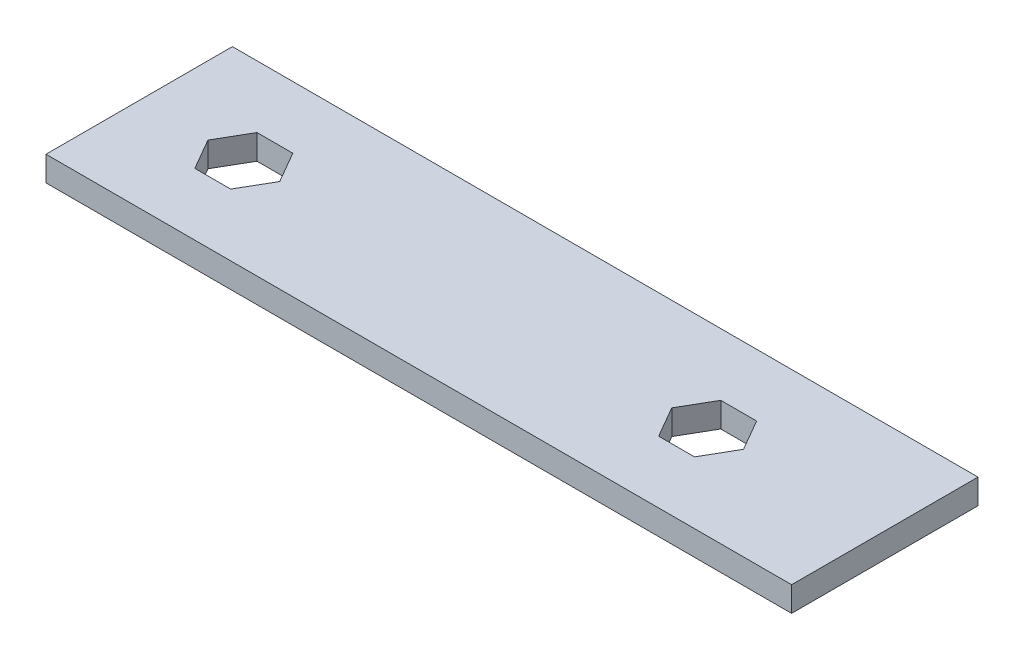
ISO-10303-21;
HEADER;
FILE_DESCRIPTION(('STEP AP214'),'2;1');
FILE_NAME('part.step','',(''),(''),'','','');
FILE_SCHEMA(('AUTOMOTIVE_DESIGN { 1 0 10303 214 1 1 1 1 }'));
ENDSEC;
DATA;
#1=APPLICATION_CONTEXT('core data for automotive mechanical design processes');
#2=APPLICATION_PROTOCOL_DEFINITION('international standard','automotive_design',2000,#1);
#3=PRODUCT_CONTEXT('',#1,'mechanical');
#4=PRODUCT('Part','Part','',(#3));
#5=PRODUCT_RELATED_PRODUCT_CATEGORY('part','',(#4));
#6=PRODUCT_DEFINITION_FORMATION('','',#4);
#7=PRODUCT_DEFINITION_CONTEXT('part definition',#1,'design');
#8=PRODUCT_DEFINITION('design','',#6,#7);
#9=PRODUCT_DEFINITION_SHAPE('','',#8);
#10=(LENGTH_UNIT() NAMED_UNIT(*) SI_UNIT(.MILLI.,.METRE.));
#11=(NAMED_UNIT(*) PLANE_ANGLE_UNIT() SI_UNIT($,.RADIAN.));
#12=(NAMED_UNIT(*) SI_UNIT($,.STERADIAN.) SOLID_ANGLE_UNIT());
#13=UNCERTAINTY_MEASURE_WITH_UNIT(LENGTH_MEASURE(1.E-05),#10,'distance_accuracy_value','');
#14=(GEOMETRIC_REPRESENTATION_CONTEXT(3) GLOBAL_UNCERTAINTY_ASSIGNED_CONTEXT((#13)) GLOBAL_UNIT_ASSIGNED_CONTEXT((#10,
#11,#12)) REPRESENTATION_CONTEXT('',''));
#15=CARTESIAN_POINT('',(0.,0.,0.));
#16=DIRECTION('',(0.,0.,1.));
#17=DIRECTION('',(1.,0.,0.));
#18=AXIS2_PLACEMENT_3D('',#15,#16,#17);
#19=CARTESIAN_POINT('',(0.,5.08000000000004,0.));
#20=DIRECTION('',(1.,0.,0.));
#21=DIRECTION('',(0.,0.,-1.));
#22=AXIS2_PLACEMENT_3D('',#19,#20,#21);
#23=PLANE('',#22);
#24=DIRECTION('',(0.,0.,1.));
#25=VECTOR('',#24,1.);
#26=CARTESIAN_POINT('',(0.,0.,0.));
#27=LINE('',#26,#25);
#28=CARTESIAN_POINT('',(0.,0.,-38.1));
#29=VERTEX_POINT('',#28);
#30=CARTESIAN_POINT('',(0.,0.,0.));
#31=VERTEX_POINT('',#30);
#32=EDGE_CURVE('E237',#29,#31,#27,.T.);
#33=ORIENTED_EDGE('',*,*,#32,.T.);
#34=DIRECTION('',(0.,-1.,0.));
#35=VECTOR('',#34,1.);
#36=CARTESIAN_POINT('',(0.,5.08000000000004,0.));
#37=LINE('',#36,#35);
#38=CARTESIAN_POINT('',(0.,5.08000000000004,0.));
#39=VERTEX_POINT('',#38);
#40=EDGE_CURVE('E11',#39,#31,#37,.T.);
#41=ORIENTED_EDGE('',*,*,#40,.F.);
#42=DIRECTION('',(0.,0.,1.));
#43=VECTOR('',#42,1.);
#44=CARTESIAN_POINT('',(0.,5.08000000000004,0.));
#45=LINE('',#44,#43);
#46=CARTESIAN_POINT('',(0.,5.08000000000004,-38.1));
#47=VERTEX_POINT('',#46);
#48=EDGE_CURVE('E248',#47,#39,#45,.T.);
#49=ORIENTED_EDGE('',*,*,#48,.F.);
#50=DIRECTION('',(0.,-1.,0.));
#51=VECTOR('',#50,1.);
#52=CARTESIAN_POINT('',(0.,5.08000000000004,-38.1));
#53=LINE('',#52,#51);
#54=EDGE_CURVE('E258',#47,#29,#53,.T.);
#55=ORIENTED_EDGE('',*,*,#54,.T.);
#56=EDGE_LOOP('',(#33,#41,#49,#55));
#57=FACE_BOUND('',#56,.T.);
#58=ADVANCED_FACE('F35',(#57),#23,.F.);
#59=CARTESIAN_POINT('',(0.,5.08000000000004,0.));
#60=DIRECTION('',(0.,0.,-1.));
#61=DIRECTION('',(-1.,0.,0.));
#62=AXIS2_PLACEMENT_3D('',#59,#60,#61);
#63=PLANE('',#62);
#64=DIRECTION('',(1.,0.,0.));
#65=VECTOR('',#64,1.);
#66=CARTESIAN_POINT('',(0.,0.,0.));
#67=LINE('',#66,#65);
#68=CARTESIAN_POINT('',(152.4,0.,0.));
#69=VERTEX_POINT('',#68);
#70=EDGE_CURVE('E261',#31,#69,#67,.T.);
#71=ORIENTED_EDGE('',*,*,#70,.T.);
#72=DIRECTION('',(0.,-1.,0.));
#73=VECTOR('',#72,1.);
#74=CARTESIAN_POINT('',(152.4,5.08000000000004,0.));
#75=LINE('',#74,#73);
#76=CARTESIAN_POINT('',(152.4,5.08000000000004,0.));
#77=VERTEX_POINT('',#76);
#78=EDGE_CURVE('E42',#77,#69,#75,.T.);
#79=ORIENTED_EDGE('',*,*,#78,.F.);
#80=DIRECTION('',(1.,0.,0.));
#81=VECTOR('',#80,1.);
#82=CARTESIAN_POINT('',(0.,5.08000000000004,0.));
#83=LINE('',#82,#81);
#84=EDGE_CURVE('E251',#39,#77,#83,.T.);
#85=ORIENTED_EDGE('',*,*,#84,.F.);
#86=ORIENTED_EDGE('',*,*,#40,.T.);
#87=EDGE_LOOP('',(#71,#79,#85,#86));
#88=FACE_BOUND('',#87,.T.);
#89=ADVANCED_FACE('F290',(#88),#63,.F.);
#90=CARTESIAN_POINT('',(152.4,5.08000000000004,0.));
#91=DIRECTION('',(-1.,0.,0.));
#92=DIRECTION('',(0.,0.,1.));
#93=AXIS2_PLACEMENT_3D('',#90,#91,#92);
#94=PLANE('',#93);
#95=DIRECTION('',(0.,0.,-1.));
#96=VECTOR('',#95,1.);
#97=CARTESIAN_POINT('',(152.4,0.,0.));
#98=LINE('',#97,#96);
#99=CARTESIAN_POINT('',(152.4,0.,-38.1));
#100=VERTEX_POINT('',#99);
#101=EDGE_CURVE('E263',#69,#100,#98,.T.);
#102=ORIENTED_EDGE('',*,*,#101,.T.);
#103=DIRECTION('',(0.,-1.,0.));
#104=VECTOR('',#103,1.);
#105=CARTESIAN_POINT('',(152.4,5.08000000000004,-38.1));
#106=LINE('',#105,#104);
#107=CARTESIAN_POINT('',(152.4,5.08000000000004,-38.1));
#108=VERTEX_POINT('',#107);
#109=EDGE_CURVE('E268',#108,#100,#106,.T.);
#110=ORIENTED_EDGE('',*,*,#109,.F.);
#111=DIRECTION('',(0.,0.,-1.));
#112=VECTOR('',#111,1.);
#113=CARTESIAN_POINT('',(152.4,5.08000000000004,0.));
#114=LINE('',#113,#112);
#115=EDGE_CURVE('E254',#77,#108,#114,.T.);
#116=ORIENTED_EDGE('',*,*,#115,.F.);
#117=ORIENTED_EDGE('',*,*,#78,.T.);
#118=EDGE_LOOP('',(#102,#110,#116,#117));
#119=FACE_BOUND('',#118,.T.);
#120=ADVANCED_FACE('F275',(#119),#94,.F.);
#121=CARTESIAN_POINT('',(0.,5.08000000000004,-38.1));
#122=DIRECTION('',(0.,0.,1.));
#123=DIRECTION('',(1.,0.,0.));
#124=AXIS2_PLACEMENT_3D('',#121,#122,#123);
#125=PLANE('',#124);
#126=DIRECTION('',(-1.,0.,0.));
#127=VECTOR('',#126,1.);
#128=CARTESIAN_POINT('',(0.,0.,-38.1));
#129=LINE('',#128,#127);
#130=EDGE_CURVE('E252',#100,#29,#129,.T.);
#131=ORIENTED_EDGE('',*,*,#130,.T.);
#132=ORIENTED_EDGE('',*,*,#54,.F.);
#133=DIRECTION('',(-1.,0.,0.));
#134=VECTOR('',#133,1.);
#135=CARTESIAN_POINT('',(0.,5.08000000000004,-38.1));
#136=LINE('',#135,#134);
#137=EDGE_CURVE('E256',#108,#47,#136,.T.);
#138=ORIENTED_EDGE('',*,*,#137,.F.);
#139=ORIENTED_EDGE('',*,*,#109,.T.);
#140=EDGE_LOOP('',(#131,#132,#138,#139));
#141=FACE_BOUND('',#140,.T.);
#142=ADVANCED_FACE('F283',(#141),#125,.F.);
#143=CARTESIAN_POINT('',(0.,5.08000000000004,0.));
#144=DIRECTION('',(0.,-1.,0.));
#145=DIRECTION('',(0.,0.,-1.));
#146=AXIS2_PLACEMENT_3D('',#143,#144,#145);
#147=PLANE('',#146);
#148=DIRECTION('',(-1.,0.,0.));
#149=VECTOR('',#148,1.);
#150=CARTESIAN_POINT('',(119.853560993621,5.08000000000004,-25.4));
#151=LINE('',#150,#149);
#152=CARTESIAN_POINT('',(119.853560993621,5.08000000000004,-25.4));
#153=VERTEX_POINT('',#152);
#154=CARTESIAN_POINT('',(112.521212574913,5.08000000000004,-25.4));
#155=VERTEX_POINT('',#154);
#156=EDGE_CURVE('E180',#153,#155,#151,.T.);
#157=ORIENTED_EDGE('',*,*,#156,.F.);
#158=DIRECTION('',(-0.5,0.,-0.866025403784438));
#159=VECTOR('',#158,1.);
#160=CARTESIAN_POINT('',(123.519735202975,5.08000000000004,-19.05));
#161=LINE('',#160,#159);
#162=CARTESIAN_POINT('',(123.519735202975,5.08000000000004,-19.05));
#163=VERTEX_POINT('',#162);
#164=EDGE_CURVE('E49',#163,#153,#161,.T.);
#165=ORIENTED_EDGE('',*,*,#164,.F.);
#166=DIRECTION('',(0.500000000000001,0.,-0.866025403784438));
#167=VECTOR('',#166,1.);
#168=CARTESIAN_POINT('',(119.853560993621,5.08000000000004,-12.7));
#169=LINE('',#168,#167);
#170=CARTESIAN_POINT('',(119.853560993621,5.08000000000004,-12.7));
#171=VERTEX_POINT('',#170);
#172=EDGE_CURVE('E166',#171,#163,#169,.T.);
#173=ORIENTED_EDGE('',*,*,#172,.F.);
#174=DIRECTION('',(1.,0.,0.));
#175=VECTOR('',#174,1.);
#176=CARTESIAN_POINT('',(112.521212574913,5.08000000000004,-12.7));
#177=LINE('',#176,#175);
#178=CARTESIAN_POINT('',(112.521212574913,5.08000000000004,-12.7));
#179=VERTEX_POINT('',#178);
#180=EDGE_CURVE('E169',#179,#171,#177,.T.);
#181=ORIENTED_EDGE('',*,*,#180,.F.);
#182=DIRECTION('',(0.5,0.,0.866025403784439));
#183=VECTOR('',#182,1.);
#184=CARTESIAN_POINT('',(108.855038365558,5.08000000000004,-19.05));
#185=LINE('',#184,#183);
#186=CARTESIAN_POINT('',(108.855038365558,5.08000000000004,-19.05));
#187=VERTEX_POINT('',#186);
#188=EDGE_CURVE('E185',#187,#179,#185,.T.);
#189=ORIENTED_EDGE('',*,*,#188,.F.);
#190=DIRECTION('',(-0.5,0.,0.866025403784439));
#191=VECTOR('',#190,1.);
#192=CARTESIAN_POINT('',(112.521212574913,5.08000000000004,-25.4));
#193=LINE('',#192,#191);
#194=EDGE_CURVE('E182',#155,#187,#193,.T.);
#195=ORIENTED_EDGE('',*,*,#194,.F.);
#196=EDGE_LOOP('',(#157,#165,#173,#181,#189,#195));
#197=FACE_BOUND('',#196,.T.);
#198=DIRECTION('',(0.5,0.,-0.866025403784439));
#199=VECTOR('',#198,1.);
#200=CARTESIAN_POINT('',(25.0498168807581,5.08000000000004,-12.7));
#201=LINE('',#200,#199);
#202=CARTESIAN_POINT('',(25.0498168807581,5.08000000000004,-12.7));
#203=VERTEX_POINT('',#202);
#204=CARTESIAN_POINT('',(28.7159910901122,5.08000000000004,-19.05));
#205=VERTEX_POINT('',#204);
#206=EDGE_CURVE('E221',#203,#205,#201,.T.);
#207=ORIENTED_EDGE('',*,*,#206,.F.);
#208=DIRECTION('',(1.,0.,0.));
#209=VECTOR('',#208,1.);
#210=CARTESIAN_POINT('',(17.7174684620499,5.08000000000004,-12.7));
#211=LINE('',#210,#209);
#212=CARTESIAN_POINT('',(17.7174684620499,5.08000000000004,-12.7));
#213=VERTEX_POINT('',#212);
#214=EDGE_CURVE('E192',#213,#203,#211,.T.);
#215=ORIENTED_EDGE('',*,*,#214,.F.);
#216=DIRECTION('',(0.499999999999999,0.,0.866025403784439));
#217=VECTOR('',#216,1.);
#218=CARTESIAN_POINT('',(14.0512942526958,5.08000000000004,-19.05));
#219=LINE('',#218,#217);
#220=CARTESIAN_POINT('',(14.0512942526958,5.08000000000004,-19.05));
#221=VERTEX_POINT('',#220);
#222=EDGE_CURVE('E204',#221,#213,#219,.T.);
#223=ORIENTED_EDGE('',*,*,#222,.F.);
#224=DIRECTION('',(-0.5,0.,0.866025403784439));
#225=VECTOR('',#224,1.);
#226=CARTESIAN_POINT('',(17.7174684620499,5.08000000000004,-25.4));
#227=LINE('',#226,#225);
#228=CARTESIAN_POINT('',(17.7174684620499,5.08000000000004,-25.4));
#229=VERTEX_POINT('',#228);
#230=EDGE_CURVE('E230',#229,#221,#227,.T.);
#231=ORIENTED_EDGE('',*,*,#230,.F.);
#232=DIRECTION('',(-1.,0.,0.));
#233=VECTOR('',#232,1.);
#234=CARTESIAN_POINT('',(25.0498168807581,5.08000000000004,-25.4));
#235=LINE('',#234,#233);
#236=CARTESIAN_POINT('',(25.0498168807581,5.08000000000004,-25.4));
#237=VERTEX_POINT('',#236);
#238=EDGE_CURVE('E227',#237,#229,#235,.T.);
#239=ORIENTED_EDGE('',*,*,#238,.F.);
#240=DIRECTION('',(-0.5,0.,-0.866025403784439));
#241=VECTOR('',#240,1.);
#242=CARTESIAN_POINT('',(28.7159910901122,5.08000000000004,-19.05));
#243=LINE('',#242,#241);
#244=EDGE_CURVE('E224',#205,#237,#243,.T.);
#245=ORIENTED_EDGE('',*,*,#244,.F.);
#246=EDGE_LOOP('',(#207,#215,#223,#231,#239,#245));
#247=FACE_BOUND('',#246,.T.);
#248=ORIENTED_EDGE('',*,*,#48,.T.);
#249=ORIENTED_EDGE('',*,*,#84,.T.);
#250=ORIENTED_EDGE('',*,*,#115,.T.);
#251=ORIENTED_EDGE('',*,*,#137,.T.);
#252=EDGE_LOOP('',(#248,#249,#250,#251));
#253=FACE_BOUND('',#252,.T.);
#254=ADVANCED_FACE('F289',(#197,#247,#253),#147,.F.);
#255=CARTESIAN_POINT('',(0.,0.,0.));
#256=DIRECTION('',(0.,-1.,0.));
#257=DIRECTION('',(0.,0.,-1.));
#258=AXIS2_PLACEMENT_3D('',#255,#256,#257);
#259=PLANE('',#258);
#260=DIRECTION('',(-0.5,0.,-0.866025403784438));
#261=VECTOR('',#260,1.);
#262=CARTESIAN_POINT('',(123.519735202975,0.,-19.05));
#263=LINE('',#262,#261);
#264=CARTESIAN_POINT('',(123.519735202975,0.,-19.05));
#265=VERTEX_POINT('',#264);
#266=CARTESIAN_POINT('',(119.853560993621,0.,-25.4));
#267=VERTEX_POINT('',#266);
#268=EDGE_CURVE('E149',#265,#267,#263,.T.);
#269=ORIENTED_EDGE('',*,*,#268,.T.);
#270=DIRECTION('',(-1.,0.,0.));
#271=VECTOR('',#270,1.);
#272=CARTESIAN_POINT('',(119.853560993621,0.,-25.4));
#273=LINE('',#272,#271);
#274=CARTESIAN_POINT('',(112.521212574913,0.,-25.4));
#275=VERTEX_POINT('',#274);
#276=EDGE_CURVE('E158',#267,#275,#273,.T.);
#277=ORIENTED_EDGE('',*,*,#276,.T.);
#278=DIRECTION('',(-0.5,0.,0.866025403784439));
#279=VECTOR('',#278,1.);
#280=CARTESIAN_POINT('',(112.521212574913,0.,-25.4));
#281=LINE('',#280,#279);
#282=CARTESIAN_POINT('',(108.855038365558,0.,-19.05));
#283=VERTEX_POINT('',#282);
#284=EDGE_CURVE('E57',#275,#283,#281,.T.);
#285=ORIENTED_EDGE('',*,*,#284,.T.);
#286=DIRECTION('',(0.5,0.,0.866025403784439));
#287=VECTOR('',#286,1.);
#288=CARTESIAN_POINT('',(108.855038365558,0.,-19.05));
#289=LINE('',#288,#287);
#290=CARTESIAN_POINT('',(112.521212574913,0.,-12.7));
#291=VERTEX_POINT('',#290);
#292=EDGE_CURVE('E173',#283,#291,#289,.T.);
#293=ORIENTED_EDGE('',*,*,#292,.T.);
#294=DIRECTION('',(1.,0.,0.));
#295=VECTOR('',#294,1.);
#296=CARTESIAN_POINT('',(112.521212574913,0.,-12.7));
#297=LINE('',#296,#295);
#298=CARTESIAN_POINT('',(119.853560993621,0.,-12.7));
#299=VERTEX_POINT('',#298);
#300=EDGE_CURVE('E176',#291,#299,#297,.T.);
#301=ORIENTED_EDGE('',*,*,#300,.T.);
#302=DIRECTION('',(0.500000000000001,0.,-0.866025403784438));
#303=VECTOR('',#302,1.);
#304=CARTESIAN_POINT('',(119.853560993621,0.,-12.7));
#305=LINE('',#304,#303);
#306=EDGE_CURVE('E155',#299,#265,#305,.T.);
#307=ORIENTED_EDGE('',*,*,#306,.T.);
#308=EDGE_LOOP('',(#269,#277,#285,#293,#301,#307));
#309=FACE_BOUND('',#308,.T.);
#310=DIRECTION('',(1.,0.,0.));
#311=VECTOR('',#310,1.);
#312=CARTESIAN_POINT('',(17.7174684620499,0.,-12.7));
#313=LINE('',#312,#311);
#314=CARTESIAN_POINT('',(17.7174684620499,0.,-12.7));
#315=VERTEX_POINT('',#314);
#316=CARTESIAN_POINT('',(25.0498168807581,0.,-12.7));
#317=VERTEX_POINT('',#316);
#318=EDGE_CURVE('E200',#315,#317,#313,.T.);
#319=ORIENTED_EDGE('',*,*,#318,.T.);
#320=DIRECTION('',(0.5,0.,-0.866025403784439));
#321=VECTOR('',#320,1.);
#322=CARTESIAN_POINT('',(25.0498168807581,0.,-12.7));
#323=LINE('',#322,#321);
#324=CARTESIAN_POINT('',(28.7159910901123,0.,-19.05));
#325=VERTEX_POINT('',#324);
#326=EDGE_CURVE('E203',#317,#325,#323,.T.);
#327=ORIENTED_EDGE('',*,*,#326,.T.);
#328=DIRECTION('',(-0.5,0.,-0.866025403784439));
#329=VECTOR('',#328,1.);
#330=CARTESIAN_POINT('',(28.7159910901122,0.,-19.05));
#331=LINE('',#330,#329);
#332=CARTESIAN_POINT('',(25.0498168807581,0.,-25.4));
#333=VERTEX_POINT('',#332);
#334=EDGE_CURVE('E207',#325,#333,#331,.T.);
#335=ORIENTED_EDGE('',*,*,#334,.T.);
#336=DIRECTION('',(-1.,0.,0.));
#337=VECTOR('',#336,1.);
#338=CARTESIAN_POINT('',(25.0498168807581,0.,-25.4));
#339=LINE('',#338,#337);
#340=CARTESIAN_POINT('',(17.7174684620499,0.,-25.4));
#341=VERTEX_POINT('',#340);
#342=EDGE_CURVE('E210',#333,#341,#339,.T.);
#343=ORIENTED_EDGE('',*,*,#342,.T.);
#344=DIRECTION('',(-0.5,0.,0.866025403784439));
#345=VECTOR('',#344,1.);
#346=CARTESIAN_POINT('',(17.7174684620499,0.,-25.4));
#347=LINE('',#346,#345);
#348=CARTESIAN_POINT('',(14.0512942526958,0.,-19.05));
#349=VERTEX_POINT('',#348);
#350=EDGE_CURVE('E213',#341,#349,#347,.T.);
#351=ORIENTED_EDGE('',*,*,#350,.T.);
#352=DIRECTION('',(0.499999999999999,0.,0.866025403784439));
#353=VECTOR('',#352,1.);
#354=CARTESIAN_POINT('',(14.0512942526958,0.,-19.05));
#355=LINE('',#354,#353);
#356=EDGE_CURVE('E216',#349,#315,#355,.T.);
#357=ORIENTED_EDGE('',*,*,#356,.T.);
#358=EDGE_LOOP('',(#319,#327,#335,#343,#351,#357));
#359=FACE_BOUND('',#358,.T.);
#360=ORIENTED_EDGE('',*,*,#32,.F.);
#361=ORIENTED_EDGE('',*,*,#130,.F.);
#362=ORIENTED_EDGE('',*,*,#101,.F.);
#363=ORIENTED_EDGE('',*,*,#70,.F.);
#364=EDGE_LOOP('',(#360,#361,#362,#363));
#365=FACE_BOUND('',#364,.T.);
#366=ADVANCED_FACE('F162',(#309,#359,#365),#259,.T.);
#367=CARTESIAN_POINT('',(17.7174684620499,0.,-12.7));
#368=DIRECTION('',(0.,0.,1.));
#369=DIRECTION('',(1.,0.,0.));
#370=AXIS2_PLACEMENT_3D('',#367,#368,#369);
#371=PLANE('',#370);
#372=ORIENTED_EDGE('',*,*,#214,.T.);
#373=DIRECTION('',(0.,1.,0.));
#374=VECTOR('',#373,1.);
#375=CARTESIAN_POINT('',(25.0498168807581,0.,-12.7));
#376=LINE('',#375,#374);
#377=EDGE_CURVE('E219',#317,#203,#376,.T.);
#378=ORIENTED_EDGE('',*,*,#377,.F.);
#379=ORIENTED_EDGE('',*,*,#318,.F.);
#380=DIRECTION('',(0.,1.,0.));
#381=VECTOR('',#380,1.);
#382=CARTESIAN_POINT('',(17.7174684620499,0.,-12.7));
#383=LINE('',#382,#381);
#384=EDGE_CURVE('E235',#315,#213,#383,.T.);
#385=ORIENTED_EDGE('',*,*,#384,.T.);
#386=EDGE_LOOP('',(#372,#378,#379,#385));
#387=FACE_BOUND('',#386,.T.);
#388=ADVANCED_FACE('F302',(#387),#371,.F.);
#389=CARTESIAN_POINT('',(14.0512942526958,0.,-19.05));
#390=DIRECTION('',(-0.866025403784439,0.,0.499999999999999));
#391=DIRECTION('',(0.499999999999999,0.,0.866025403784439));
#392=AXIS2_PLACEMENT_3D('',#389,#390,#391);
#393=PLANE('',#392);
#394=ORIENTED_EDGE('',*,*,#222,.T.);
#395=ORIENTED_EDGE('',*,*,#384,.F.);
#396=ORIENTED_EDGE('',*,*,#356,.F.);
#397=DIRECTION('',(0.,1.,0.));
#398=VECTOR('',#397,1.);
#399=CARTESIAN_POINT('',(14.0512942526958,0.,-19.05));
#400=LINE('',#399,#398);
#401=EDGE_CURVE('E238',#349,#221,#400,.T.);
#402=ORIENTED_EDGE('',*,*,#401,.T.);
#403=EDGE_LOOP('',(#394,#395,#396,#402));
#404=FACE_BOUND('',#403,.T.);
#405=ADVANCED_FACE('F308',(#404),#393,.F.);
#406=CARTESIAN_POINT('',(17.7174684620499,0.,-25.4));
#407=DIRECTION('',(-0.866025403784439,0.,-0.5));
#408=DIRECTION('',(-0.5,0.,0.866025403784439));
#409=AXIS2_PLACEMENT_3D('',#406,#407,#408);
#410=PLANE('',#409);
#411=ORIENTED_EDGE('',*,*,#230,.T.);
#412=ORIENTED_EDGE('',*,*,#401,.F.);
#413=ORIENTED_EDGE('',*,*,#350,.F.);
#414=DIRECTION('',(0.,1.,0.));
#415=VECTOR('',#414,1.);
#416=CARTESIAN_POINT('',(17.7174684620499,0.,-25.4));
#417=LINE('',#416,#415);
#418=EDGE_CURVE('E240',#341,#229,#417,.T.);
#419=ORIENTED_EDGE('',*,*,#418,.T.);
#420=EDGE_LOOP('',(#411,#412,#413,#419));
#421=FACE_BOUND('',#420,.T.);
#422=ADVANCED_FACE('F321',(#421),#410,.F.);
#423=CARTESIAN_POINT('',(25.0498168807581,0.,-25.4));
#424=DIRECTION('',(0.,0.,-1.));
#425=DIRECTION('',(-1.,0.,0.));
#426=AXIS2_PLACEMENT_3D('',#423,#424,#425);
#427=PLANE('',#426);
#428=ORIENTED_EDGE('',*,*,#238,.T.);
#429=ORIENTED_EDGE('',*,*,#418,.F.);
#430=ORIENTED_EDGE('',*,*,#342,.F.);
#431=DIRECTION('',(0.,1.,0.));
#432=VECTOR('',#431,1.);
#433=CARTESIAN_POINT('',(25.0498168807581,0.,-25.4));
#434=LINE('',#433,#432);
#435=EDGE_CURVE('E242',#333,#237,#434,.T.);
#436=ORIENTED_EDGE('',*,*,#435,.T.);
#437=EDGE_LOOP('',(#428,#429,#430,#436));
#438=FACE_BOUND('',#437,.T.);
#439=ADVANCED_FACE('F317',(#438),#427,.F.);
#440=CARTESIAN_POINT('',(28.7159910901122,0.,-19.05));
#441=DIRECTION('',(0.866025403784439,0.,-0.5));
#442=DIRECTION('',(-0.5,0.,-0.866025403784439));
#443=AXIS2_PLACEMENT_3D('',#440,#441,#442);
#444=PLANE('',#443);
#445=ORIENTED_EDGE('',*,*,#244,.T.);
#446=ORIENTED_EDGE('',*,*,#435,.F.);
#447=ORIENTED_EDGE('',*,*,#334,.F.);
#448=DIRECTION('',(0.,1.,0.));
#449=VECTOR('',#448,1.);
#450=CARTESIAN_POINT('',(28.7159910901122,0.,-19.05));
#451=LINE('',#450,#449);
#452=EDGE_CURVE('E244',#325,#205,#451,.T.);
#453=ORIENTED_EDGE('',*,*,#452,.T.);
#454=EDGE_LOOP('',(#445,#446,#447,#453));
#455=FACE_BOUND('',#454,.T.);
#456=ADVANCED_FACE('F313',(#455),#444,.F.);
#457=CARTESIAN_POINT('',(25.0498168807581,0.,-12.7));
#458=DIRECTION('',(0.866025403784439,0.,0.5));
#459=DIRECTION('',(0.5,0.,-0.866025403784439));
#460=AXIS2_PLACEMENT_3D('',#457,#458,#459);
#461=PLANE('',#460);
#462=ORIENTED_EDGE('',*,*,#206,.T.);
#463=ORIENTED_EDGE('',*,*,#452,.F.);
#464=ORIENTED_EDGE('',*,*,#326,.F.);
#465=ORIENTED_EDGE('',*,*,#377,.T.);
#466=EDGE_LOOP('',(#462,#463,#464,#465));
#467=FACE_BOUND('',#466,.T.);
#468=ADVANCED_FACE('F310',(#467),#461,.F.);
#469=CARTESIAN_POINT('',(123.519735202975,0.,-19.05));
#470=DIRECTION('',(0.866025403784438,0.,-0.5));
#471=DIRECTION('',(-0.5,0.,-0.866025403784438));
#472=AXIS2_PLACEMENT_3D('',#469,#470,#471);
#473=PLANE('',#472);
#474=ORIENTED_EDGE('',*,*,#164,.T.);
#475=DIRECTION('',(0.,1.,0.));
#476=VECTOR('',#475,1.);
#477=CARTESIAN_POINT('',(119.853560993621,0.,-25.4));
#478=LINE('',#477,#476);
#479=EDGE_CURVE('E145',#267,#153,#478,.T.);
#480=ORIENTED_EDGE('',*,*,#479,.F.);
#481=ORIENTED_EDGE('',*,*,#268,.F.);
#482=DIRECTION('',(0.,1.,0.));
#483=VECTOR('',#482,1.);
#484=CARTESIAN_POINT('',(123.519735202975,0.,-19.05));
#485=LINE('',#484,#483);
#486=EDGE_CURVE('E190',#265,#163,#485,.T.);
#487=ORIENTED_EDGE('',*,*,#486,.T.);
#488=EDGE_LOOP('',(#474,#480,#481,#487));
#489=FACE_BOUND('',#488,.T.);
#490=ADVANCED_FACE('F147',(#489),#473,.F.);
#491=CARTESIAN_POINT('',(119.853560993621,0.,-12.7));
#492=DIRECTION('',(0.866025403784438,0.,0.500000000000001));
#493=DIRECTION('',(0.500000000000001,0.,-0.866025403784438));
#494=AXIS2_PLACEMENT_3D('',#491,#492,#493);
#495=PLANE('',#494);
#496=ORIENTED_EDGE('',*,*,#172,.T.);
#497=ORIENTED_EDGE('',*,*,#486,.F.);
#498=ORIENTED_EDGE('',*,*,#306,.F.);
#499=DIRECTION('',(0.,1.,0.));
#500=VECTOR('',#499,1.);
#501=CARTESIAN_POINT('',(119.853560993621,0.,-12.7));
#502=LINE('',#501,#500);
#503=EDGE_CURVE('E193',#299,#171,#502,.T.);
#504=ORIENTED_EDGE('',*,*,#503,.T.);
#505=EDGE_LOOP('',(#496,#497,#498,#504));
#506=FACE_BOUND('',#505,.T.);
#507=ADVANCED_FACE('F331',(#506),#495,.F.);
#508=CARTESIAN_POINT('',(112.521212574913,0.,-12.7));
#509=DIRECTION('',(0.,0.,1.));
#510=DIRECTION('',(1.,0.,0.));
#511=AXIS2_PLACEMENT_3D('',#508,#509,#510);
#512=PLANE('',#511);
#513=ORIENTED_EDGE('',*,*,#180,.T.);
#514=ORIENTED_EDGE('',*,*,#503,.F.);
#515=ORIENTED_EDGE('',*,*,#300,.F.);
#516=DIRECTION('',(0.,1.,0.));
#517=VECTOR('',#516,1.);
#518=CARTESIAN_POINT('',(112.521212574913,0.,-12.7));
#519=LINE('',#518,#517);
#520=EDGE_CURVE('E195',#291,#179,#519,.T.);
#521=ORIENTED_EDGE('',*,*,#520,.T.);
#522=EDGE_LOOP('',(#513,#514,#515,#521));
#523=FACE_BOUND('',#522,.T.);
#524=ADVANCED_FACE('F340',(#523),#512,.F.);
#525=CARTESIAN_POINT('',(108.855038365558,0.,-19.05));
#526=DIRECTION('',(-0.866025403784439,0.,0.5));
#527=DIRECTION('',(0.5,0.,0.866025403784439));
#528=AXIS2_PLACEMENT_3D('',#525,#526,#527);
#529=PLANE('',#528);
#530=ORIENTED_EDGE('',*,*,#188,.T.);
#531=ORIENTED_EDGE('',*,*,#520,.F.);
#532=ORIENTED_EDGE('',*,*,#292,.F.);
#533=DIRECTION('',(0.,1.,0.));
#534=VECTOR('',#533,1.);
#535=CARTESIAN_POINT('',(108.855038365558,0.,-19.05));
#536=LINE('',#535,#534);
#537=EDGE_CURVE('E197',#283,#187,#536,.T.);
#538=ORIENTED_EDGE('',*,*,#537,.T.);
#539=EDGE_LOOP('',(#530,#531,#532,#538));
#540=FACE_BOUND('',#539,.T.);
#541=ADVANCED_FACE('F337',(#540),#529,.F.);
#542=CARTESIAN_POINT('',(112.521212574913,0.,-25.4));
#543=DIRECTION('',(-0.866025403784439,0.,-0.5));
#544=DIRECTION('',(-0.5,0.,0.866025403784439));
#545=AXIS2_PLACEMENT_3D('',#542,#543,#544);
#546=PLANE('',#545);
#547=ORIENTED_EDGE('',*,*,#194,.T.);
#548=ORIENTED_EDGE('',*,*,#537,.F.);
#549=ORIENTED_EDGE('',*,*,#284,.F.);
#550=DIRECTION('',(0.,1.,0.));
#551=VECTOR('',#550,1.);
#552=CARTESIAN_POINT('',(112.521212574913,0.,-25.4));
#553=LINE('',#552,#551);
#554=EDGE_CURVE('E154',#275,#155,#553,.T.);
#555=ORIENTED_EDGE('',*,*,#554,.T.);
#556=EDGE_LOOP('',(#547,#548,#549,#555));
#557=FACE_BOUND('',#556,.T.);
#558=ADVANCED_FACE('F334',(#557),#546,.F.);
#559=CARTESIAN_POINT('',(119.853560993621,0.,-25.4));
#560=DIRECTION('',(0.,0.,-1.));
#561=DIRECTION('',(-1.,0.,0.));
#562=AXIS2_PLACEMENT_3D('',#559,#560,#561);
#563=PLANE('',#562);
#564=ORIENTED_EDGE('',*,*,#156,.T.);
#565=ORIENTED_EDGE('',*,*,#554,.F.);
#566=ORIENTED_EDGE('',*,*,#276,.F.);
#567=ORIENTED_EDGE('',*,*,#479,.T.);
#568=EDGE_LOOP('',(#564,#565,#566,#567));
#569=FACE_BOUND('',#568,.T.);
#570=ADVANCED_FACE('F159',(#569),#563,.F.);
#571=CLOSED_SHELL('',(#58,#89,#120,#142,#254,#366,#388,#405,#422,#439,#456,#468,#490,#507,#524,
#541,#558,#570));
#572=MANIFOLD_SOLID_BREP('B2',#571);
#573=ADVANCED_BREP_SHAPE_REPRESENTATION('',(#18,#572),#14);
#574=SHAPE_DEFINITION_REPRESENTATION(#9,#573);
ENDSEC;
END-ISO-10303-21;
